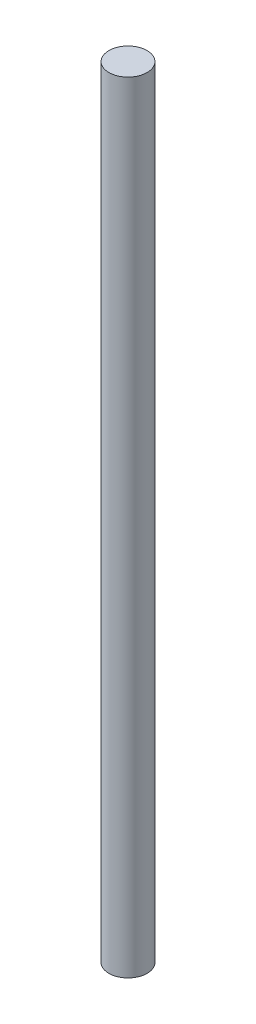
ISO-10303-21;
HEADER;
FILE_DESCRIPTION(('STEP AP214'),'2;1');
FILE_NAME('part.step','',(''),(''),'','','');
FILE_SCHEMA(('AUTOMOTIVE_DESIGN { 1 0 10303 214 1 1 1 1 }'));
ENDSEC;
DATA;
#1=APPLICATION_CONTEXT('core data for automotive mechanical design processes');
#2=APPLICATION_PROTOCOL_DEFINITION('international standard','automotive_design',2000,#1);
#3=PRODUCT_CONTEXT('',#1,'mechanical');
#4=PRODUCT('Part','Part','',(#3));
#5=PRODUCT_RELATED_PRODUCT_CATEGORY('part','',(#4));
#6=PRODUCT_DEFINITION_FORMATION('','',#4);
#7=PRODUCT_DEFINITION_CONTEXT('part definition',#1,'design');
#8=PRODUCT_DEFINITION('design','',#6,#7);
#9=PRODUCT_DEFINITION_SHAPE('','',#8);
#10=(LENGTH_UNIT() NAMED_UNIT(*) SI_UNIT(.MILLI.,.METRE.));
#11=(NAMED_UNIT(*) PLANE_ANGLE_UNIT() SI_UNIT($,.RADIAN.));
#12=(NAMED_UNIT(*) SI_UNIT($,.STERADIAN.) SOLID_ANGLE_UNIT());
#13=UNCERTAINTY_MEASURE_WITH_UNIT(LENGTH_MEASURE(1.E-05),#10,'distance_accuracy_value','');
#14=(GEOMETRIC_REPRESENTATION_CONTEXT(3) GLOBAL_UNCERTAINTY_ASSIGNED_CONTEXT((#13)) GLOBAL_UNIT_ASSIGNED_CONTEXT((#10,
#11,#12)) REPRESENTATION_CONTEXT('',''));
#15=CARTESIAN_POINT('',(0.,0.,0.));
#16=DIRECTION('',(0.,0.,1.));
#17=DIRECTION('',(1.,0.,0.));
#18=AXIS2_PLACEMENT_3D('',#15,#16,#17);
#19=CARTESIAN_POINT('',(0.,1432.,0.));
#20=DIRECTION('',(0.,-1.,0.));
#21=DIRECTION('',(0.,0.,-1.));
#22=AXIS2_PLACEMENT_3D('',#19,#20,#21);
#23=CYLINDRICAL_SURFACE('',#22,35.);
#24=CARTESIAN_POINT('',(0.,1432.,0.));
#25=DIRECTION('',(0.,1.,0.));
#26=DIRECTION('',(0.,0.,1.));
#27=AXIS2_PLACEMENT_3D('',#24,#25,#26);
#28=CIRCLE('',#27,35.);
#29=CARTESIAN_POINT('',(0.,1432.,-35.));
#30=VERTEX_POINT('',#29);
#31=EDGE_CURVE('E10',#30,#30,#28,.T.);
#32=CARTESIAN_POINT('',(0.,0.,0.));
#33=DIRECTION('',(0.,1.,0.));
#34=DIRECTION('',(0.,0.,1.));
#35=AXIS2_PLACEMENT_3D('',#32,#33,#34);
#36=CIRCLE('',#35,35.);
#37=CARTESIAN_POINT('',(0.,-2.22044604925031E-13,-35.));
#38=VERTEX_POINT('',#37);
#39=EDGE_CURVE('E38',#38,#38,#36,.T.);
#40=CARTESIAN_POINT('',(0.,1432.,-35.));
#41=CARTESIAN_POINT('',(0.,1417.08333333333,-35.));
#42=CARTESIAN_POINT('',(0.,1402.16666666667,-35.));
#43=CARTESIAN_POINT('',(0.,1372.33333333333,-35.));
#44=CARTESIAN_POINT('',(0.,1357.41666666667,-35.));
#45=CARTESIAN_POINT('',(0.,1327.58333333333,-35.));
#46=CARTESIAN_POINT('',(0.,1312.66666666667,-35.));
#47=CARTESIAN_POINT('',(0.,1282.83333333333,-35.));
#48=CARTESIAN_POINT('',(0.,1267.91666666667,-35.));
#49=CARTESIAN_POINT('',(0.,1238.08333333333,-35.));
#50=CARTESIAN_POINT('',(0.,1223.16666666667,-35.));
#51=CARTESIAN_POINT('',(0.,1193.33333333333,-35.));
#52=CARTESIAN_POINT('',(0.,1178.41666666667,-35.));
#53=CARTESIAN_POINT('',(0.,1148.58333333333,-35.));
#54=CARTESIAN_POINT('',(0.,1133.66666666667,-35.));
#55=CARTESIAN_POINT('',(0.,1103.83333333333,-35.));
#56=CARTESIAN_POINT('',(0.,1088.91666666667,-35.));
#57=CARTESIAN_POINT('',(0.,1059.08333333333,-35.));
#58=CARTESIAN_POINT('',(0.,1044.16666666667,-35.));
#59=CARTESIAN_POINT('',(0.,1014.33333333333,-35.));
#60=CARTESIAN_POINT('',(0.,999.416666666666,-35.));
#61=CARTESIAN_POINT('',(0.,969.583333333333,-35.));
#62=CARTESIAN_POINT('',(0.,954.666666666666,-35.));
#63=CARTESIAN_POINT('',(0.,924.833333333333,-35.));
#64=CARTESIAN_POINT('',(0.,909.916666666667,-35.));
#65=CARTESIAN_POINT('',(0.,880.083333333333,-35.));
#66=CARTESIAN_POINT('',(0.,865.166666666666,-35.));
#67=CARTESIAN_POINT('',(0.,835.333333333333,-35.));
#68=CARTESIAN_POINT('',(0.,820.416666666667,-35.));
#69=CARTESIAN_POINT('',(0.,790.583333333333,-35.));
#70=CARTESIAN_POINT('',(0.,775.666666666667,-35.));
#71=CARTESIAN_POINT('',(0.,745.833333333333,-35.));
#72=CARTESIAN_POINT('',(0.,730.916666666666,-35.));
#73=CARTESIAN_POINT('',(0.,701.083333333333,-35.));
#74=CARTESIAN_POINT('',(0.,686.166666666666,-35.));
#75=CARTESIAN_POINT('',(0.,656.333333333333,-35.));
#76=CARTESIAN_POINT('',(0.,641.416666666666,-35.));
#77=CARTESIAN_POINT('',(0.,611.583333333333,-35.));
#78=CARTESIAN_POINT('',(0.,596.666666666666,-35.));
#79=CARTESIAN_POINT('',(0.,566.833333333333,-35.));
#80=CARTESIAN_POINT('',(0.,551.916666666666,-35.));
#81=CARTESIAN_POINT('',(0.,522.083333333333,-35.));
#82=CARTESIAN_POINT('',(0.,507.166666666666,-35.));
#83=CARTESIAN_POINT('',(0.,477.333333333333,-35.));
#84=CARTESIAN_POINT('',(0.,462.416666666666,-35.));
#85=CARTESIAN_POINT('',(0.,432.583333333333,-35.));
#86=CARTESIAN_POINT('',(0.,417.666666666667,-35.));
#87=CARTESIAN_POINT('',(0.,387.833333333333,-35.));
#88=CARTESIAN_POINT('',(0.,372.916666666667,-35.));
#89=CARTESIAN_POINT('',(0.,343.083333333333,-35.));
#90=CARTESIAN_POINT('',(0.,328.166666666667,-35.));
#91=CARTESIAN_POINT('',(0.,298.333333333333,-35.));
#92=CARTESIAN_POINT('',(0.,283.416666666666,-35.));
#93=CARTESIAN_POINT('',(0.,253.583333333333,-35.));
#94=CARTESIAN_POINT('',(0.,238.666666666666,-35.));
#95=CARTESIAN_POINT('',(0.,208.833333333333,-35.));
#96=CARTESIAN_POINT('',(0.,193.916666666667,-35.));
#97=CARTESIAN_POINT('',(0.,164.083333333333,-35.));
#98=CARTESIAN_POINT('',(0.,149.166666666666,-35.));
#99=CARTESIAN_POINT('',(0.,119.333333333333,-35.));
#100=CARTESIAN_POINT('',(0.,104.416666666667,-35.));
#101=CARTESIAN_POINT('',(0.,74.5833333333332,-35.));
#102=CARTESIAN_POINT('',(0.,59.6666666666665,-35.));
#103=CARTESIAN_POINT('',(0.,29.8333333333332,-35.));
#104=CARTESIAN_POINT('',(0.,14.9166666666665,-35.));
#105=CARTESIAN_POINT('',(0.,-2.22044604925031E-13,-35.));
#106=B_SPLINE_CURVE_WITH_KNOTS('',3,(#40,#41,#42,#43,#44,#45,#46,#47,#48,#49,#50,#51,#52,#53,
#54,#55,#56,#57,#58,#59,#60,#61,#62,#63,#64,#65,#66,#67,#68,#69,#70,#71,#72,#73,#74,#75,#76,#77,
#78,#79,#80,#81,#82,#83,#84,#85,#86,#87,#88,#89,#90,#91,#92,#93,#94,#95,#96,#97,#98,#99,#100,
#101,#102,#103,#104,#105),.UNSPECIFIED.,.F.,.F.,(4,2,2,2,2,2,2,2,2,2,2,2,2,2,2,2,2,2,2,2,2,2,2,
2,2,2,2,2,2,2,2,2,4),(0.,44.7500000000001,89.5000000000001,134.25,179.,223.75,268.5,313.25,358.,
402.75,447.5,492.25,537.,581.75,626.5,671.25,716.,760.75,805.5,850.25,895.,939.75,984.5,1029.25,
1074.,1118.75,1163.5,1208.25,1253.,1297.75,1342.5,1387.25,1432.),.UNSPECIFIED.);
#107=EDGE_CURVE('BSEAM35',#30,#38,#106,.T.);
#108=ORIENTED_EDGE('',*,*,#31,.F.);
#109=ORIENTED_EDGE('',*,*,#39,.T.);
#110=ORIENTED_EDGE('',*,*,#107,.T.);
#111=ORIENTED_EDGE('',*,*,#107,.F.);
#112=EDGE_LOOP('',(#108,#110,#109,#111));
#113=FACE_BOUND('',#112,.T.);
#114=ADVANCED_FACE('F35',(#113),#23,.T.);
#115=CARTESIAN_POINT('',(0.,1432.,0.));
#116=DIRECTION('',(0.,1.,0.));
#117=DIRECTION('',(0.,0.,1.));
#118=AXIS2_PLACEMENT_3D('',#115,#116,#117);
#119=PLANE('',#118);
#120=ORIENTED_EDGE('',*,*,#31,.T.);
#121=EDGE_LOOP('',(#120));
#122=FACE_BOUND('',#121,.T.);
#123=ADVANCED_FACE('F50',(#122),#119,.T.);
#124=CARTESIAN_POINT('',(0.,0.,0.));
#125=DIRECTION('',(0.,1.,0.));
#126=DIRECTION('',(0.,0.,1.));
#127=AXIS2_PLACEMENT_3D('',#124,#125,#126);
#128=PLANE('',#127);
#129=ORIENTED_EDGE('',*,*,#39,.F.);
#130=EDGE_LOOP('',(#129));
#131=FACE_BOUND('',#130,.T.);
#132=ADVANCED_FACE('F48',(#131),#128,.F.);
#133=CLOSED_SHELL('',(#114,#123,#132));
#134=MANIFOLD_SOLID_BREP('B2',#133);
#135=ADVANCED_BREP_SHAPE_REPRESENTATION('',(#18,#134),#14);
#136=SHAPE_DEFINITION_REPRESENTATION(#9,#135);
ENDSEC;
END-ISO-10303-21;
